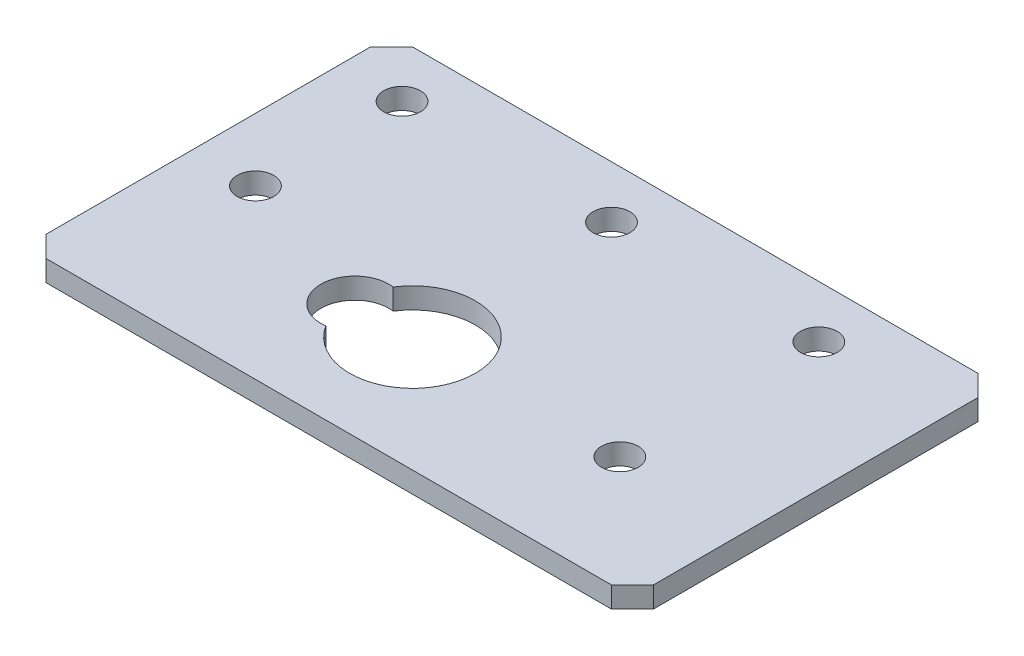
ISO-10303-21;
HEADER;
FILE_DESCRIPTION(('STEP AP214'),'2;1');
FILE_NAME('part.step','',(''),(''),'','','');
FILE_SCHEMA(('AUTOMOTIVE_DESIGN { 1 0 10303 214 1 1 1 1 }'));
ENDSEC;
DATA;
#1=APPLICATION_CONTEXT('core data for automotive mechanical design processes');
#2=APPLICATION_PROTOCOL_DEFINITION('international standard','automotive_design',2000,#1);
#3=PRODUCT_CONTEXT('',#1,'mechanical');
#4=PRODUCT('Part','Part','',(#3));
#5=PRODUCT_RELATED_PRODUCT_CATEGORY('part','',(#4));
#6=PRODUCT_DEFINITION_FORMATION('','',#4);
#7=PRODUCT_DEFINITION_CONTEXT('part definition',#1,'design');
#8=PRODUCT_DEFINITION('design','',#6,#7);
#9=PRODUCT_DEFINITION_SHAPE('','',#8);
#10=(LENGTH_UNIT() NAMED_UNIT(*) SI_UNIT(.MILLI.,.METRE.));
#11=(NAMED_UNIT(*) PLANE_ANGLE_UNIT() SI_UNIT($,.RADIAN.));
#12=(NAMED_UNIT(*) SI_UNIT($,.STERADIAN.) SOLID_ANGLE_UNIT());
#13=UNCERTAINTY_MEASURE_WITH_UNIT(LENGTH_MEASURE(1.E-05),#10,'distance_accuracy_value','');
#14=(GEOMETRIC_REPRESENTATION_CONTEXT(3) GLOBAL_UNCERTAINTY_ASSIGNED_CONTEXT((#13)) GLOBAL_UNIT_ASSIGNED_CONTEXT((#10,
#11,#12)) REPRESENTATION_CONTEXT('',''));
#15=CARTESIAN_POINT('',(0.,0.,0.));
#16=DIRECTION('',(0.,0.,1.));
#17=DIRECTION('',(1.,0.,0.));
#18=AXIS2_PLACEMENT_3D('',#15,#16,#17);
#19=CARTESIAN_POINT('',(0.,2.,0.));
#20=DIRECTION('',(0.,-1.,0.));
#21=DIRECTION('',(0.,0.,-1.));
#22=AXIS2_PLACEMENT_3D('',#19,#20,#21);
#23=PLANE('',#22);
#24=CARTESIAN_POINT('',(-8.50000000000001,2.,6.50000000000001));
#25=DIRECTION('',(0.,1.,0.));
#26=DIRECTION('',(0.,0.,1.));
#27=AXIS2_PLACEMENT_3D('',#24,#25,#26);
#28=CIRCLE('',#27,3.25);
#29=CARTESIAN_POINT('',(-8.06250000000001,2.,3.27958174300294));
#30=VERTEX_POINT('',#29);
#31=CARTESIAN_POINT('',(-8.06250000000001,2.,9.72041825699707));
#32=VERTEX_POINT('',#31);
#33=EDGE_CURVE('E153',#30,#32,#28,.T.);
#34=ORIENTED_EDGE('',*,*,#33,.F.);
#35=CARTESIAN_POINT('',(-3.00000000000001,2.,6.50000000000001));
#36=DIRECTION('',(0.,1.,0.));
#37=DIRECTION('',(0.,0.,1.));
#38=AXIS2_PLACEMENT_3D('',#35,#36,#37);
#39=CIRCLE('',#38,6.);
#40=EDGE_CURVE('E137',#32,#30,#39,.T.);
#41=ORIENTED_EDGE('',*,*,#40,.F.);
#42=EDGE_LOOP('',(#34,#41));
#43=FACE_BOUND('',#42,.T.);
#44=CARTESIAN_POINT('',(-23.,2.,-12.5));
#45=DIRECTION('',(0.,-1.,0.));
#46=DIRECTION('',(0.,0.,-1.));
#47=AXIS2_PLACEMENT_3D('',#44,#45,#46);
#48=CIRCLE('',#47,1.75);
#49=CARTESIAN_POINT('',(-23.,2.,-14.25));
#50=VERTEX_POINT('',#49);
#51=EDGE_CURVE('E166',#50,#50,#48,.T.);
#52=ORIENTED_EDGE('',*,*,#51,.T.);
#53=EDGE_LOOP('',(#52));
#54=FACE_BOUND('',#53,.T.);
#55=CARTESIAN_POINT('',(-3.,2.,-12.5));
#56=DIRECTION('',(0.,-1.,0.));
#57=DIRECTION('',(0.,0.,-1.));
#58=AXIS2_PLACEMENT_3D('',#55,#56,#57);
#59=CIRCLE('',#58,1.75);
#60=CARTESIAN_POINT('',(-3.,2.,-14.25));
#61=VERTEX_POINT('',#60);
#62=EDGE_CURVE('E174',#61,#61,#59,.T.);
#63=ORIENTED_EDGE('',*,*,#62,.T.);
#64=EDGE_LOOP('',(#63));
#65=FACE_BOUND('',#64,.T.);
#66=CARTESIAN_POINT('',(16.8,2.,-12.5));
#67=DIRECTION('',(0.,-1.,0.));
#68=DIRECTION('',(0.,0.,-1.));
#69=AXIS2_PLACEMENT_3D('',#66,#67,#68);
#70=CIRCLE('',#69,1.75);
#71=CARTESIAN_POINT('',(16.8,2.,-14.25));
#72=VERTEX_POINT('',#71);
#73=EDGE_CURVE('E182',#72,#72,#70,.T.);
#74=ORIENTED_EDGE('',*,*,#73,.T.);
#75=EDGE_LOOP('',(#74));
#76=FACE_BOUND('',#75,.T.);
#77=CARTESIAN_POINT('',(16.8,2.,6.50000000000001));
#78=DIRECTION('',(0.,-1.,0.));
#79=DIRECTION('',(0.,0.,-1.));
#80=AXIS2_PLACEMENT_3D('',#77,#78,#79);
#81=CIRCLE('',#80,1.75);
#82=CARTESIAN_POINT('',(16.8,2.,4.75000000000001));
#83=VERTEX_POINT('',#82);
#84=EDGE_CURVE('E190',#83,#83,#81,.T.);
#85=ORIENTED_EDGE('',*,*,#84,.T.);
#86=EDGE_LOOP('',(#85));
#87=FACE_BOUND('',#86,.T.);
#88=CARTESIAN_POINT('',(-23.,2.,1.5));
#89=DIRECTION('',(0.,-1.,0.));
#90=DIRECTION('',(0.,0.,-1.));
#91=AXIS2_PLACEMENT_3D('',#88,#89,#90);
#92=CIRCLE('',#91,1.75);
#93=CARTESIAN_POINT('',(-23.,2.,-0.249999999999993));
#94=VERTEX_POINT('',#93);
#95=EDGE_CURVE('E198',#94,#94,#92,.T.);
#96=ORIENTED_EDGE('',*,*,#95,.T.);
#97=EDGE_LOOP('',(#96));
#98=FACE_BOUND('',#97,.T.);
#99=DIRECTION('',(-1.,0.,0.));
#100=VECTOR('',#99,1.);
#101=CARTESIAN_POINT('',(-29.,2.,-17.5));
#102=LINE('',#101,#100);
#103=CARTESIAN_POINT('',(27.,2.,-17.5));
#104=VERTEX_POINT('',#103);
#105=CARTESIAN_POINT('',(-27.,2.,-17.5));
#106=VERTEX_POINT('',#105);
#107=EDGE_CURVE('E207',#104,#106,#102,.T.);
#108=ORIENTED_EDGE('',*,*,#107,.T.);
#109=DIRECTION('',(0.707106781186549,0.,-0.707106781186546));
#110=VECTOR('',#109,1.);
#111=CARTESIAN_POINT('',(-29.,2.,-15.5));
#112=LINE('',#111,#110);
#113=CARTESIAN_POINT('',(-29.,2.,-15.5));
#114=VERTEX_POINT('',#113);
#115=EDGE_CURVE('E265',#106,#114,#112,.F.);
#116=ORIENTED_EDGE('',*,*,#115,.T.);
#117=DIRECTION('',(0.,0.,1.));
#118=VECTOR('',#117,1.);
#119=CARTESIAN_POINT('',(-29.,2.,17.5));
#120=LINE('',#119,#118);
#121=CARTESIAN_POINT('',(-29.,2.,15.5));
#122=VERTEX_POINT('',#121);
#123=EDGE_CURVE('E212',#114,#122,#120,.T.);
#124=ORIENTED_EDGE('',*,*,#123,.T.);
#125=DIRECTION('',(-0.707106781186546,0.,-0.707106781186549));
#126=VECTOR('',#125,1.);
#127=CARTESIAN_POINT('',(-27.,2.,17.5));
#128=LINE('',#127,#126);
#129=CARTESIAN_POINT('',(-27.,2.,17.5));
#130=VERTEX_POINT('',#129);
#131=EDGE_CURVE('E75',#122,#130,#128,.F.);
#132=ORIENTED_EDGE('',*,*,#131,.T.);
#133=DIRECTION('',(1.,0.,0.));
#134=VECTOR('',#133,1.);
#135=CARTESIAN_POINT('',(-29.,2.,17.5));
#136=LINE('',#135,#134);
#137=CARTESIAN_POINT('',(27.,2.,17.5));
#138=VERTEX_POINT('',#137);
#139=EDGE_CURVE('E215',#130,#138,#136,.T.);
#140=ORIENTED_EDGE('',*,*,#139,.T.);
#141=DIRECTION('',(-0.707106781186548,0.,0.707106781186548));
#142=VECTOR('',#141,1.);
#143=CARTESIAN_POINT('',(29.,2.,15.5));
#144=LINE('',#143,#142);
#145=CARTESIAN_POINT('',(29.,2.,15.5));
#146=VERTEX_POINT('',#145);
#147=EDGE_CURVE('E257',#138,#146,#144,.F.);
#148=ORIENTED_EDGE('',*,*,#147,.T.);
#149=DIRECTION('',(0.,0.,-1.));
#150=VECTOR('',#149,1.);
#151=CARTESIAN_POINT('',(29.,2.,17.5));
#152=LINE('',#151,#150);
#153=CARTESIAN_POINT('',(29.,2.,-15.5));
#154=VERTEX_POINT('',#153);
#155=EDGE_CURVE('E203',#146,#154,#152,.T.);
#156=ORIENTED_EDGE('',*,*,#155,.T.);
#157=DIRECTION('',(0.707106781186548,0.,0.707106781186548));
#158=VECTOR('',#157,1.);
#159=CARTESIAN_POINT('',(27.,2.,-17.5));
#160=LINE('',#159,#158);
#161=EDGE_CURVE('E260',#154,#104,#160,.F.);
#162=ORIENTED_EDGE('',*,*,#161,.T.);
#163=EDGE_LOOP('',(#108,#116,#124,#132,#140,#148,#156,#162));
#164=FACE_BOUND('',#163,.T.);
#165=ADVANCED_FACE('F51',(#43,#54,#65,#76,#87,#98,#164),#23,.F.);
#166=CARTESIAN_POINT('',(29.,2.,17.5));
#167=DIRECTION('',(-1.,0.,0.));
#168=DIRECTION('',(0.,0.,1.));
#169=AXIS2_PLACEMENT_3D('',#166,#167,#168);
#170=PLANE('',#169);
#171=DIRECTION('',(0.,0.,-1.));
#172=VECTOR('',#171,1.);
#173=CARTESIAN_POINT('',(29.,0.,17.5));
#174=LINE('',#173,#172);
#175=CARTESIAN_POINT('',(29.,0.,15.5));
#176=VERTEX_POINT('',#175);
#177=CARTESIAN_POINT('',(29.,0.,-15.5));
#178=VERTEX_POINT('',#177);
#179=EDGE_CURVE('E202',#176,#178,#174,.T.);
#180=ORIENTED_EDGE('',*,*,#179,.T.);
#181=DIRECTION('',(0.,1.,0.));
#182=VECTOR('',#181,1.);
#183=CARTESIAN_POINT('',(29.,2.,-15.5));
#184=LINE('',#183,#182);
#185=EDGE_CURVE('E11',#178,#154,#184,.T.);
#186=ORIENTED_EDGE('',*,*,#185,.T.);
#187=ORIENTED_EDGE('',*,*,#155,.F.);
#188=DIRECTION('',(0.,-1.,0.));
#189=VECTOR('',#188,1.);
#190=CARTESIAN_POINT('',(29.,2.,15.5));
#191=LINE('',#190,#189);
#192=EDGE_CURVE('E61',#146,#176,#191,.T.);
#193=ORIENTED_EDGE('',*,*,#192,.T.);
#194=EDGE_LOOP('',(#180,#186,#187,#193));
#195=FACE_BOUND('',#194,.T.);
#196=ADVANCED_FACE('F279',(#195),#170,.F.);
#197=CARTESIAN_POINT('',(-29.,2.,-17.5));
#198=DIRECTION('',(0.,0.,1.));
#199=DIRECTION('',(1.,0.,0.));
#200=AXIS2_PLACEMENT_3D('',#197,#198,#199);
#201=PLANE('',#200);
#202=DIRECTION('',(-1.,0.,0.));
#203=VECTOR('',#202,1.);
#204=CARTESIAN_POINT('',(-29.,0.,-17.5));
#205=LINE('',#204,#203);
#206=CARTESIAN_POINT('',(27.,0.,-17.5));
#207=VERTEX_POINT('',#206);
#208=CARTESIAN_POINT('',(-27.,0.,-17.5));
#209=VERTEX_POINT('',#208);
#210=EDGE_CURVE('E222',#207,#209,#205,.T.);
#211=ORIENTED_EDGE('',*,*,#210,.T.);
#212=DIRECTION('',(0.,1.,0.));
#213=VECTOR('',#212,1.);
#214=CARTESIAN_POINT('',(-27.,2.,-17.5));
#215=LINE('',#214,#213);
#216=EDGE_CURVE('E254',#209,#106,#215,.T.);
#217=ORIENTED_EDGE('',*,*,#216,.T.);
#218=ORIENTED_EDGE('',*,*,#107,.F.);
#219=DIRECTION('',(0.,-1.,0.));
#220=VECTOR('',#219,1.);
#221=CARTESIAN_POINT('',(27.,2.,-17.5));
#222=LINE('',#221,#220);
#223=EDGE_CURVE('E250',#104,#207,#222,.T.);
#224=ORIENTED_EDGE('',*,*,#223,.T.);
#225=EDGE_LOOP('',(#211,#217,#218,#224));
#226=FACE_BOUND('',#225,.T.);
#227=ADVANCED_FACE('F293',(#226),#201,.F.);
#228=CARTESIAN_POINT('',(-29.,2.,17.5));
#229=DIRECTION('',(1.,0.,0.));
#230=DIRECTION('',(0.,0.,-1.));
#231=AXIS2_PLACEMENT_3D('',#228,#229,#230);
#232=PLANE('',#231);
#233=ORIENTED_EDGE('',*,*,#123,.F.);
#234=DIRECTION('',(0.,-1.,0.));
#235=VECTOR('',#234,1.);
#236=CARTESIAN_POINT('',(-29.,2.,-15.5));
#237=LINE('',#236,#235);
#238=CARTESIAN_POINT('',(-29.,0.,-15.5));
#239=VERTEX_POINT('',#238);
#240=EDGE_CURVE('E234',#114,#239,#237,.T.);
#241=ORIENTED_EDGE('',*,*,#240,.T.);
#242=DIRECTION('',(0.,0.,1.));
#243=VECTOR('',#242,1.);
#244=CARTESIAN_POINT('',(-29.,0.,17.5));
#245=LINE('',#244,#243);
#246=CARTESIAN_POINT('',(-29.,0.,15.5));
#247=VERTEX_POINT('',#246);
#248=EDGE_CURVE('E226',#239,#247,#245,.T.);
#249=ORIENTED_EDGE('',*,*,#248,.T.);
#250=DIRECTION('',(0.,1.,0.));
#251=VECTOR('',#250,1.);
#252=CARTESIAN_POINT('',(-29.,2.,15.5));
#253=LINE('',#252,#251);
#254=EDGE_CURVE('E218',#247,#122,#253,.T.);
#255=ORIENTED_EDGE('',*,*,#254,.T.);
#256=EDGE_LOOP('',(#233,#241,#249,#255));
#257=FACE_BOUND('',#256,.T.);
#258=ADVANCED_FACE('F301',(#257),#232,.F.);
#259=CARTESIAN_POINT('',(-29.,2.,17.5));
#260=DIRECTION('',(0.,0.,-1.));
#261=DIRECTION('',(-1.,0.,0.));
#262=AXIS2_PLACEMENT_3D('',#259,#260,#261);
#263=PLANE('',#262);
#264=ORIENTED_EDGE('',*,*,#139,.F.);
#265=DIRECTION('',(0.,-1.,0.));
#266=VECTOR('',#265,1.);
#267=CARTESIAN_POINT('',(-27.,2.,17.5));
#268=LINE('',#267,#266);
#269=CARTESIAN_POINT('',(-27.,0.,17.5));
#270=VERTEX_POINT('',#269);
#271=EDGE_CURVE('E270',#130,#270,#268,.T.);
#272=ORIENTED_EDGE('',*,*,#271,.T.);
#273=DIRECTION('',(1.,0.,0.));
#274=VECTOR('',#273,1.);
#275=CARTESIAN_POINT('',(-29.,0.,17.5));
#276=LINE('',#275,#274);
#277=CARTESIAN_POINT('',(27.,0.,17.5));
#278=VERTEX_POINT('',#277);
#279=EDGE_CURVE('E208',#270,#278,#276,.T.);
#280=ORIENTED_EDGE('',*,*,#279,.T.);
#281=DIRECTION('',(0.,1.,0.));
#282=VECTOR('',#281,1.);
#283=CARTESIAN_POINT('',(27.,2.,17.5));
#284=LINE('',#283,#282);
#285=EDGE_CURVE('E68',#278,#138,#284,.T.);
#286=ORIENTED_EDGE('',*,*,#285,.T.);
#287=EDGE_LOOP('',(#264,#272,#280,#286));
#288=FACE_BOUND('',#287,.T.);
#289=ADVANCED_FACE('F306',(#288),#263,.F.);
#290=CARTESIAN_POINT('',(0.,0.,0.));
#291=DIRECTION('',(0.,-1.,0.));
#292=DIRECTION('',(0.,0.,-1.));
#293=AXIS2_PLACEMENT_3D('',#290,#291,#292);
#294=PLANE('',#293);
#295=CARTESIAN_POINT('',(-3.00000000000001,0.,6.50000000000001));
#296=DIRECTION('',(0.,1.,0.));
#297=DIRECTION('',(0.,0.,1.));
#298=AXIS2_PLACEMENT_3D('',#295,#296,#297);
#299=CIRCLE('',#298,6.);
#300=CARTESIAN_POINT('',(-8.06250000000001,0.,9.72041825699707));
#301=VERTEX_POINT('',#300);
#302=CARTESIAN_POINT('',(-8.06250000000001,0.,3.27958174300294));
#303=VERTEX_POINT('',#302);
#304=EDGE_CURVE('E134',#301,#303,#299,.T.);
#305=ORIENTED_EDGE('',*,*,#304,.T.);
#306=CARTESIAN_POINT('',(-8.50000000000001,0.,6.50000000000001));
#307=DIRECTION('',(0.,1.,0.));
#308=DIRECTION('',(0.,0.,1.));
#309=AXIS2_PLACEMENT_3D('',#306,#307,#308);
#310=CIRCLE('',#309,3.25);
#311=EDGE_CURVE('E143',#303,#301,#310,.T.);
#312=ORIENTED_EDGE('',*,*,#311,.T.);
#313=EDGE_LOOP('',(#305,#312));
#314=FACE_BOUND('',#313,.T.);
#315=CARTESIAN_POINT('',(-23.,0.,-12.5));
#316=DIRECTION('',(0.,1.,0.));
#317=DIRECTION('',(0.,0.,1.));
#318=AXIS2_PLACEMENT_3D('',#315,#316,#317);
#319=CIRCLE('',#318,1.75);
#320=CARTESIAN_POINT('',(-23.,0.,-10.75));
#321=VERTEX_POINT('',#320);
#322=EDGE_CURVE('E161',#321,#321,#319,.T.);
#323=ORIENTED_EDGE('',*,*,#322,.T.);
#324=EDGE_LOOP('',(#323));
#325=FACE_BOUND('',#324,.T.);
#326=CARTESIAN_POINT('',(-3.,0.,-12.5));
#327=DIRECTION('',(0.,1.,0.));
#328=DIRECTION('',(0.,0.,1.));
#329=AXIS2_PLACEMENT_3D('',#326,#327,#328);
#330=CIRCLE('',#329,1.75);
#331=CARTESIAN_POINT('',(-3.,0.,-10.75));
#332=VERTEX_POINT('',#331);
#333=EDGE_CURVE('E170',#332,#332,#330,.T.);
#334=ORIENTED_EDGE('',*,*,#333,.T.);
#335=EDGE_LOOP('',(#334));
#336=FACE_BOUND('',#335,.T.);
#337=CARTESIAN_POINT('',(16.8,0.,-12.5));
#338=DIRECTION('',(0.,1.,0.));
#339=DIRECTION('',(0.,0.,1.));
#340=AXIS2_PLACEMENT_3D('',#337,#338,#339);
#341=CIRCLE('',#340,1.75);
#342=CARTESIAN_POINT('',(16.8,0.,-10.75));
#343=VERTEX_POINT('',#342);
#344=EDGE_CURVE('E178',#343,#343,#341,.T.);
#345=ORIENTED_EDGE('',*,*,#344,.T.);
#346=EDGE_LOOP('',(#345));
#347=FACE_BOUND('',#346,.T.);
#348=CARTESIAN_POINT('',(16.8,0.,6.50000000000001));
#349=DIRECTION('',(0.,1.,0.));
#350=DIRECTION('',(0.,0.,1.));
#351=AXIS2_PLACEMENT_3D('',#348,#349,#350);
#352=CIRCLE('',#351,1.75);
#353=CARTESIAN_POINT('',(16.8,0.,8.25));
#354=VERTEX_POINT('',#353);
#355=EDGE_CURVE('E186',#354,#354,#352,.T.);
#356=ORIENTED_EDGE('',*,*,#355,.T.);
#357=EDGE_LOOP('',(#356));
#358=FACE_BOUND('',#357,.T.);
#359=CARTESIAN_POINT('',(-23.,0.,1.5));
#360=DIRECTION('',(0.,1.,0.));
#361=DIRECTION('',(0.,0.,1.));
#362=AXIS2_PLACEMENT_3D('',#359,#360,#361);
#363=CIRCLE('',#362,1.75);
#364=CARTESIAN_POINT('',(-23.,0.,3.25));
#365=VERTEX_POINT('',#364);
#366=EDGE_CURVE('E194',#365,#365,#363,.T.);
#367=ORIENTED_EDGE('',*,*,#366,.T.);
#368=EDGE_LOOP('',(#367));
#369=FACE_BOUND('',#368,.T.);
#370=ORIENTED_EDGE('',*,*,#248,.F.);
#371=DIRECTION('',(-0.707106781186549,0.,0.707106781186546));
#372=VECTOR('',#371,1.);
#373=CARTESIAN_POINT('',(-22.2499999999999,0.,-22.25));
#374=LINE('',#373,#372);
#375=EDGE_CURVE('E247',#239,#209,#374,.F.);
#376=ORIENTED_EDGE('',*,*,#375,.T.);
#377=ORIENTED_EDGE('',*,*,#210,.F.);
#378=DIRECTION('',(-0.707106781186548,0.,-0.707106781186548));
#379=VECTOR('',#378,1.);
#380=CARTESIAN_POINT('',(22.25,0.,-22.25));
#381=LINE('',#380,#379);
#382=EDGE_CURVE('E241',#207,#178,#381,.F.);
#383=ORIENTED_EDGE('',*,*,#382,.T.);
#384=ORIENTED_EDGE('',*,*,#179,.F.);
#385=DIRECTION('',(0.707106781186548,0.,-0.707106781186548));
#386=VECTOR('',#385,1.);
#387=CARTESIAN_POINT('',(22.25,0.,22.25));
#388=LINE('',#387,#386);
#389=EDGE_CURVE('E238',#176,#278,#388,.F.);
#390=ORIENTED_EDGE('',*,*,#389,.T.);
#391=ORIENTED_EDGE('',*,*,#279,.F.);
#392=DIRECTION('',(0.707106781186546,0.,0.707106781186549));
#393=VECTOR('',#392,1.);
#394=CARTESIAN_POINT('',(-22.25,0.,22.25));
#395=LINE('',#394,#393);
#396=EDGE_CURVE('E244',#270,#247,#395,.F.);
#397=ORIENTED_EDGE('',*,*,#396,.T.);
#398=EDGE_LOOP('',(#370,#376,#377,#383,#384,#390,#391,#397));
#399=FACE_BOUND('',#398,.T.);
#400=ADVANCED_FACE('F150',(#314,#325,#336,#347,#358,#369,#399),#294,.T.);
#401=CARTESIAN_POINT('',(-23.,2.,1.5));
#402=DIRECTION('',(0.,1.,0.));
#403=DIRECTION('',(0.,0.,1.));
#404=AXIS2_PLACEMENT_3D('',#401,#402,#403);
#405=CYLINDRICAL_SURFACE('',#404,1.75);
#406=ORIENTED_EDGE('',*,*,#366,.F.);
#407=EDGE_LOOP('',(#406));
#408=FACE_BOUND('',#407,.T.);
#409=ORIENTED_EDGE('',*,*,#95,.F.);
#410=EDGE_LOOP('',(#409));
#411=FACE_BOUND('',#410,.T.);
#412=ADVANCED_FACE('F322',(#408,#411),#405,.F.);
#413=CARTESIAN_POINT('',(16.8,2.,6.50000000000001));
#414=DIRECTION('',(0.,1.,0.));
#415=DIRECTION('',(0.,0.,1.));
#416=AXIS2_PLACEMENT_3D('',#413,#414,#415);
#417=CYLINDRICAL_SURFACE('',#416,1.75);
#418=ORIENTED_EDGE('',*,*,#355,.F.);
#419=EDGE_LOOP('',(#418));
#420=FACE_BOUND('',#419,.T.);
#421=ORIENTED_EDGE('',*,*,#84,.F.);
#422=EDGE_LOOP('',(#421));
#423=FACE_BOUND('',#422,.T.);
#424=ADVANCED_FACE('F407',(#420,#423),#417,.F.);
#425=CARTESIAN_POINT('',(16.8,2.,-12.5));
#426=DIRECTION('',(0.,1.,0.));
#427=DIRECTION('',(0.,0.,1.));
#428=AXIS2_PLACEMENT_3D('',#425,#426,#427);
#429=CYLINDRICAL_SURFACE('',#428,1.75);
#430=ORIENTED_EDGE('',*,*,#344,.F.);
#431=EDGE_LOOP('',(#430));
#432=FACE_BOUND('',#431,.T.);
#433=ORIENTED_EDGE('',*,*,#73,.F.);
#434=EDGE_LOOP('',(#433));
#435=FACE_BOUND('',#434,.T.);
#436=ADVANCED_FACE('F397',(#432,#435),#429,.F.);
#437=CARTESIAN_POINT('',(-3.,2.,-12.5));
#438=DIRECTION('',(0.,1.,0.));
#439=DIRECTION('',(0.,0.,1.));
#440=AXIS2_PLACEMENT_3D('',#437,#438,#439);
#441=CYLINDRICAL_SURFACE('',#440,1.75);
#442=ORIENTED_EDGE('',*,*,#333,.F.);
#443=EDGE_LOOP('',(#442));
#444=FACE_BOUND('',#443,.T.);
#445=ORIENTED_EDGE('',*,*,#62,.F.);
#446=EDGE_LOOP('',(#445));
#447=FACE_BOUND('',#446,.T.);
#448=ADVANCED_FACE('F387',(#444,#447),#441,.F.);
#449=CARTESIAN_POINT('',(-23.,2.,-12.5));
#450=DIRECTION('',(0.,1.,0.));
#451=DIRECTION('',(0.,0.,1.));
#452=AXIS2_PLACEMENT_3D('',#449,#450,#451);
#453=CYLINDRICAL_SURFACE('',#452,1.75);
#454=ORIENTED_EDGE('',*,*,#322,.F.);
#455=EDGE_LOOP('',(#454));
#456=FACE_BOUND('',#455,.T.);
#457=ORIENTED_EDGE('',*,*,#51,.F.);
#458=EDGE_LOOP('',(#457));
#459=FACE_BOUND('',#458,.T.);
#460=ADVANCED_FACE('F379',(#456,#459),#453,.F.);
#461=CARTESIAN_POINT('',(-3.00000000000001,0.,6.50000000000001));
#462=DIRECTION('',(0.,1.,0.));
#463=DIRECTION('',(0.,0.,1.));
#464=AXIS2_PLACEMENT_3D('',#461,#462,#463);
#465=CYLINDRICAL_SURFACE('',#464,6.);
#466=ORIENTED_EDGE('',*,*,#40,.T.);
#467=DIRECTION('',(0.,1.,0.));
#468=VECTOR('',#467,1.);
#469=CARTESIAN_POINT('',(-8.06250000000001,0.,3.27958174300294));
#470=LINE('',#469,#468);
#471=EDGE_CURVE('E130',#303,#30,#470,.T.);
#472=ORIENTED_EDGE('',*,*,#471,.F.);
#473=ORIENTED_EDGE('',*,*,#304,.F.);
#474=DIRECTION('',(0.,1.,0.));
#475=VECTOR('',#474,1.);
#476=CARTESIAN_POINT('',(-8.06250000000001,0.,9.72041825699707));
#477=LINE('',#476,#475);
#478=EDGE_CURVE('E142',#301,#32,#477,.T.);
#479=ORIENTED_EDGE('',*,*,#478,.T.);
#480=EDGE_LOOP('',(#466,#472,#473,#479));
#481=FACE_BOUND('',#480,.T.);
#482=ADVANCED_FACE('F132',(#481),#465,.F.);
#483=CARTESIAN_POINT('',(-8.50000000000001,0.,6.50000000000001));
#484=DIRECTION('',(0.,1.,0.));
#485=DIRECTION('',(0.,0.,1.));
#486=AXIS2_PLACEMENT_3D('',#483,#484,#485);
#487=CYLINDRICAL_SURFACE('',#486,3.25);
#488=ORIENTED_EDGE('',*,*,#33,.T.);
#489=ORIENTED_EDGE('',*,*,#478,.F.);
#490=ORIENTED_EDGE('',*,*,#311,.F.);
#491=ORIENTED_EDGE('',*,*,#471,.T.);
#492=EDGE_LOOP('',(#488,#489,#490,#491));
#493=FACE_BOUND('',#492,.T.);
#494=ADVANCED_FACE('F146',(#493),#487,.F.);
#495=CARTESIAN_POINT('',(-29.,2.,-15.5));
#496=DIRECTION('',(0.707106781186546,0.,0.707106781186549));
#497=DIRECTION('',(0.,-1.,0.));
#498=AXIS2_PLACEMENT_3D('',#495,#496,#497);
#499=PLANE('',#498);
#500=ORIENTED_EDGE('',*,*,#115,.F.);
#501=ORIENTED_EDGE('',*,*,#216,.F.);
#502=ORIENTED_EDGE('',*,*,#375,.F.);
#503=ORIENTED_EDGE('',*,*,#240,.F.);
#504=EDGE_LOOP('',(#500,#501,#502,#503));
#505=FACE_BOUND('',#504,.T.);
#506=ADVANCED_FACE('F299',(#505),#499,.F.);
#507=CARTESIAN_POINT('',(-27.,2.,17.5));
#508=DIRECTION('',(0.707106781186549,0.,-0.707106781186546));
#509=DIRECTION('',(0.,-1.,0.));
#510=AXIS2_PLACEMENT_3D('',#507,#508,#509);
#511=PLANE('',#510);
#512=ORIENTED_EDGE('',*,*,#131,.F.);
#513=ORIENTED_EDGE('',*,*,#254,.F.);
#514=ORIENTED_EDGE('',*,*,#396,.F.);
#515=ORIENTED_EDGE('',*,*,#271,.F.);
#516=EDGE_LOOP('',(#512,#513,#514,#515));
#517=FACE_BOUND('',#516,.T.);
#518=ADVANCED_FACE('F305',(#517),#511,.F.);
#519=CARTESIAN_POINT('',(27.,2.,-17.5));
#520=DIRECTION('',(-0.707106781186547,0.,0.707106781186547));
#521=DIRECTION('',(0.,-1.,0.));
#522=AXIS2_PLACEMENT_3D('',#519,#520,#521);
#523=PLANE('',#522);
#524=ORIENTED_EDGE('',*,*,#161,.F.);
#525=ORIENTED_EDGE('',*,*,#185,.F.);
#526=ORIENTED_EDGE('',*,*,#382,.F.);
#527=ORIENTED_EDGE('',*,*,#223,.F.);
#528=EDGE_LOOP('',(#524,#525,#526,#527));
#529=FACE_BOUND('',#528,.T.);
#530=ADVANCED_FACE('F290',(#529),#523,.F.);
#531=CARTESIAN_POINT('',(29.,2.,15.5));
#532=DIRECTION('',(-0.707106781186547,0.,-0.707106781186547));
#533=DIRECTION('',(0.,-1.,0.));
#534=AXIS2_PLACEMENT_3D('',#531,#532,#533);
#535=PLANE('',#534);
#536=ORIENTED_EDGE('',*,*,#147,.F.);
#537=ORIENTED_EDGE('',*,*,#285,.F.);
#538=ORIENTED_EDGE('',*,*,#389,.F.);
#539=ORIENTED_EDGE('',*,*,#192,.F.);
#540=EDGE_LOOP('',(#536,#537,#538,#539));
#541=FACE_BOUND('',#540,.T.);
#542=ADVANCED_FACE('F54',(#541),#535,.F.);
#543=CLOSED_SHELL('',(#165,#196,#227,#258,#289,#400,#412,#424,#436,#448,#460,#482,#494,#506,
#518,#530,#542));
#544=MANIFOLD_SOLID_BREP('B2',#543);
#545=ADVANCED_BREP_SHAPE_REPRESENTATION('',(#18,#544),#14);
#546=SHAPE_DEFINITION_REPRESENTATION(#9,#545);
ENDSEC;
END-ISO-10303-21;
